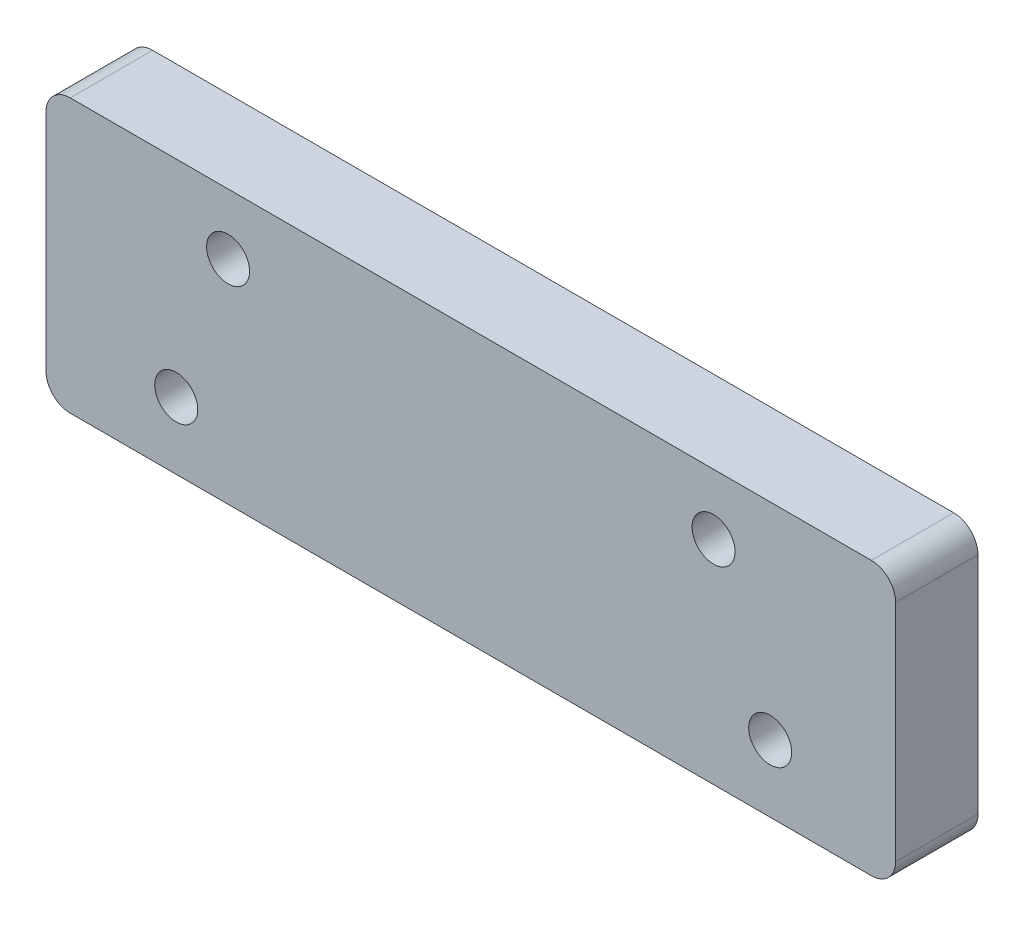
ISO-10303-21;
HEADER;
FILE_DESCRIPTION(('STEP AP214'),'2;1');
FILE_NAME('part.step','',(''),(''),'','','');
FILE_SCHEMA(('AUTOMOTIVE_DESIGN { 1 0 10303 214 1 1 1 1 }'));
ENDSEC;
DATA;
#1=APPLICATION_CONTEXT('core data for automotive mechanical design processes');
#2=APPLICATION_PROTOCOL_DEFINITION('international standard','automotive_design',2000,#1);
#3=PRODUCT_CONTEXT('',#1,'mechanical');
#4=PRODUCT('Part','Part','',(#3));
#5=PRODUCT_RELATED_PRODUCT_CATEGORY('part','',(#4));
#6=PRODUCT_DEFINITION_FORMATION('','',#4);
#7=PRODUCT_DEFINITION_CONTEXT('part definition',#1,'design');
#8=PRODUCT_DEFINITION('design','',#6,#7);
#9=PRODUCT_DEFINITION_SHAPE('','',#8);
#10=(LENGTH_UNIT() NAMED_UNIT(*) SI_UNIT(.MILLI.,.METRE.));
#11=(NAMED_UNIT(*) PLANE_ANGLE_UNIT() SI_UNIT($,.RADIAN.));
#12=(NAMED_UNIT(*) SI_UNIT($,.STERADIAN.) SOLID_ANGLE_UNIT());
#13=UNCERTAINTY_MEASURE_WITH_UNIT(LENGTH_MEASURE(1.E-05),#10,'distance_accuracy_value','');
#14=(GEOMETRIC_REPRESENTATION_CONTEXT(3) GLOBAL_UNCERTAINTY_ASSIGNED_CONTEXT((#13)) GLOBAL_UNIT_ASSIGNED_CONTEXT((#10,
#11,#12)) REPRESENTATION_CONTEXT('',''));
#15=CARTESIAN_POINT('',(0.,0.,0.));
#16=DIRECTION('',(0.,0.,1.));
#17=DIRECTION('',(1.,0.,0.));
#18=AXIS2_PLACEMENT_3D('',#15,#16,#17);
#19=CARTESIAN_POINT('',(0.,0.,-8.62));
#20=DIRECTION('',(0.,0.,-1.));
#21=DIRECTION('',(-1.,0.,0.));
#22=AXIS2_PLACEMENT_3D('',#19,#20,#21);
#23=PLANE('',#22);
#24=CARTESIAN_POINT('',(93.225,6.99999999999999,-8.62));
#25=DIRECTION('',(0.,0.,-1.));
#26=DIRECTION('',(-1.,0.,0.));
#27=AXIS2_PLACEMENT_3D('',#24,#25,#26);
#28=CIRCLE('',#27,4.00000000000001);
#29=CARTESIAN_POINT('',(89.225,6.99999999999999,-8.62));
#30=VERTEX_POINT('',#29);
#31=EDGE_CURVE('E187',#30,#30,#28,.T.);
#32=ORIENTED_EDGE('',*,*,#31,.F.);
#33=EDGE_LOOP('',(#32));
#34=FACE_BOUND('',#33,.T.);
#35=DIRECTION('',(1.00000000000003,0.,0.));
#36=VECTOR('',#35,1.);
#37=CARTESIAN_POINT('',(0.,28.5749999999998,-8.62000000000039));
#38=LINE('',#37,#36);
#39=CARTESIAN_POINT('',(19.990000000001,28.5749999999997,-8.62000000000041));
#40=VERTEX_POINT('',#39);
#41=CARTESIAN_POINT('',(103.810000000005,28.5749999999994,-8.62000000000053));
#42=VERTEX_POINT('',#41);
#43=EDGE_CURVE('E230',#40,#42,#38,.T.);
#44=ORIENTED_EDGE('',*,*,#43,.T.);
#45=CARTESIAN_POINT('',(103.81,26.0349999999994,-8.62));
#46=DIRECTION('',(0.,0.,-1.));
#47=DIRECTION('',(-1.,0.,0.));
#48=AXIS2_PLACEMENT_3D('',#45,#46,#47);
#49=CIRCLE('',#48,2.54);
#50=CARTESIAN_POINT('',(106.35,26.0349999999994,-8.62));
#51=VERTEX_POINT('',#50);
#52=EDGE_CURVE('E164',#42,#51,#49,.T.);
#53=ORIENTED_EDGE('',*,*,#52,.T.);
#54=DIRECTION('',(0.,-1.,0.));
#55=VECTOR('',#54,1.);
#56=CARTESIAN_POINT('',(106.35,15.875,-8.62));
#57=LINE('',#56,#55);
#58=CARTESIAN_POINT('',(106.35,2.54,-8.62));
#59=VERTEX_POINT('',#58);
#60=EDGE_CURVE('E184',#51,#59,#57,.T.);
#61=ORIENTED_EDGE('',*,*,#60,.T.);
#62=CARTESIAN_POINT('',(103.81,2.54,-8.62));
#63=DIRECTION('',(0.,0.,-1.));
#64=DIRECTION('',(-1.,0.,0.));
#65=AXIS2_PLACEMENT_3D('',#62,#63,#64);
#66=CIRCLE('',#65,2.54);
#67=CARTESIAN_POINT('',(103.81,0.,-8.62));
#68=VERTEX_POINT('',#67);
#69=EDGE_CURVE('E136',#59,#68,#66,.T.);
#70=ORIENTED_EDGE('',*,*,#69,.T.);
#71=DIRECTION('',(-1.,0.,0.));
#72=VECTOR('',#71,1.);
#73=CARTESIAN_POINT('',(106.35,0.,-8.62));
#74=LINE('',#73,#72);
#75=CARTESIAN_POINT('',(19.99,0.,-8.62));
#76=VERTEX_POINT('',#75);
#77=EDGE_CURVE('E177',#68,#76,#74,.T.);
#78=ORIENTED_EDGE('',*,*,#77,.T.);
#79=CARTESIAN_POINT('',(19.99,2.53999999999999,-8.62));
#80=DIRECTION('',(0.,0.,-1.));
#81=DIRECTION('',(-1.,0.,0.));
#82=AXIS2_PLACEMENT_3D('',#79,#80,#81);
#83=CIRCLE('',#82,2.54);
#84=CARTESIAN_POINT('',(17.45,2.53999999999999,-8.62));
#85=VERTEX_POINT('',#84);
#86=EDGE_CURVE('E65',#76,#85,#83,.T.);
#87=ORIENTED_EDGE('',*,*,#86,.T.);
#88=DIRECTION('',(0.,1.,0.));
#89=VECTOR('',#88,1.);
#90=CARTESIAN_POINT('',(17.45,0.,-8.62));
#91=LINE('',#90,#89);
#92=CARTESIAN_POINT('',(17.45,26.0349999999997,-8.62));
#93=VERTEX_POINT('',#92);
#94=EDGE_CURVE('E179',#85,#93,#91,.T.);
#95=ORIENTED_EDGE('',*,*,#94,.T.);
#96=CARTESIAN_POINT('',(19.99,26.0349999999997,-8.62));
#97=DIRECTION('',(0.,0.,-1.));
#98=DIRECTION('',(-1.,0.,0.));
#99=AXIS2_PLACEMENT_3D('',#96,#97,#98);
#100=CIRCLE('',#99,2.54);
#101=EDGE_CURVE('E157',#93,#40,#100,.T.);
#102=ORIENTED_EDGE('',*,*,#101,.T.);
#103=EDGE_LOOP('',(#44,#53,#61,#70,#78,#87,#95,#102));
#104=FACE_BOUND('',#103,.T.);
#105=CARTESIAN_POINT('',(31.0749999999999,7.00000000000008,-8.62));
#106=DIRECTION('',(0.,0.,-1.));
#107=DIRECTION('',(-1.,0.,0.));
#108=AXIS2_PLACEMENT_3D('',#105,#106,#107);
#109=CIRCLE('',#108,4.);
#110=CARTESIAN_POINT('',(27.0749999999999,7.00000000000008,-8.62));
#111=VERTEX_POINT('',#110);
#112=EDGE_CURVE('E180',#111,#111,#109,.T.);
#113=ORIENTED_EDGE('',*,*,#112,.F.);
#114=EDGE_LOOP('',(#113));
#115=FACE_BOUND('',#114,.T.);
#116=CARTESIAN_POINT('',(87.3,22.225,-8.62));
#117=DIRECTION('',(0.,0.,1.));
#118=DIRECTION('',(1.,0.,0.));
#119=AXIS2_PLACEMENT_3D('',#116,#117,#118);
#120=CIRCLE('',#119,2.25);
#121=CARTESIAN_POINT('',(89.55,22.225,-8.62));
#122=VERTEX_POINT('',#121);
#123=EDGE_CURVE('E242',#122,#122,#120,.T.);
#124=ORIENTED_EDGE('',*,*,#123,.T.);
#125=EDGE_LOOP('',(#124));
#126=FACE_BOUND('',#125,.T.);
#127=CARTESIAN_POINT('',(36.5,22.225,-8.62));
#128=DIRECTION('',(0.,0.,1.));
#129=DIRECTION('',(1.,0.,0.));
#130=AXIS2_PLACEMENT_3D('',#127,#128,#129);
#131=CIRCLE('',#130,2.25);
#132=CARTESIAN_POINT('',(38.75,22.225,-8.62));
#133=VERTEX_POINT('',#132);
#134=EDGE_CURVE('E252',#133,#133,#131,.T.);
#135=ORIENTED_EDGE('',*,*,#134,.T.);
#136=EDGE_LOOP('',(#135));
#137=FACE_BOUND('',#136,.T.);
#138=ADVANCED_FACE('F43',(#34,#104,#115,#126,#137),#23,.T.);
#139=CARTESIAN_POINT('',(17.45,15.875,-7.62));
#140=DIRECTION('',(-1.,0.,0.));
#141=DIRECTION('',(0.,-1.,0.));
#142=AXIS2_PLACEMENT_3D('',#139,#140,#141);
#143=PLANE('',#142);
#144=ORIENTED_EDGE('',*,*,#94,.F.);
#145=DIRECTION('',(0.,0.,1.));
#146=VECTOR('',#145,1.);
#147=CARTESIAN_POINT('',(17.45,2.53999999999999,-7.62));
#148=LINE('',#147,#146);
#149=CARTESIAN_POINT('',(17.45,2.53999999999999,0.));
#150=VERTEX_POINT('',#149);
#151=EDGE_CURVE('E11',#85,#150,#148,.T.);
#152=ORIENTED_EDGE('',*,*,#151,.T.);
#153=DIRECTION('',(0.,-1.,0.));
#154=VECTOR('',#153,1.);
#155=CARTESIAN_POINT('',(17.45,15.875,0.));
#156=LINE('',#155,#154);
#157=CARTESIAN_POINT('',(17.45,26.0349999999997,0.));
#158=VERTEX_POINT('',#157);
#159=EDGE_CURVE('E217',#158,#150,#156,.T.);
#160=ORIENTED_EDGE('',*,*,#159,.F.);
#161=DIRECTION('',(0.,0.,1.));
#162=VECTOR('',#161,1.);
#163=CARTESIAN_POINT('',(17.45,26.0349999999997,-8.62));
#164=LINE('',#163,#162);
#165=EDGE_CURVE('E52',#158,#93,#164,.F.);
#166=ORIENTED_EDGE('',*,*,#165,.T.);
#167=EDGE_LOOP('',(#144,#152,#160,#166));
#168=FACE_BOUND('',#167,.T.);
#169=ADVANCED_FACE('F222',(#168),#143,.T.);
#170=CARTESIAN_POINT('',(106.35,15.875,-7.62));
#171=DIRECTION('',(1.,0.,0.));
#172=DIRECTION('',(0.,0.,-1.));
#173=AXIS2_PLACEMENT_3D('',#170,#171,#172);
#174=PLANE('',#173);
#175=ORIENTED_EDGE('',*,*,#60,.F.);
#176=DIRECTION('',(0.,0.,1.));
#177=VECTOR('',#176,1.);
#178=CARTESIAN_POINT('',(106.35,26.0349999999994,0.));
#179=LINE('',#178,#177);
#180=CARTESIAN_POINT('',(106.35,26.0349999999994,0.));
#181=VERTEX_POINT('',#180);
#182=EDGE_CURVE('E131',#51,#181,#179,.T.);
#183=ORIENTED_EDGE('',*,*,#182,.T.);
#184=DIRECTION('',(0.,1.,0.));
#185=VECTOR('',#184,1.);
#186=CARTESIAN_POINT('',(106.35,15.875,0.));
#187=LINE('',#186,#185);
#188=CARTESIAN_POINT('',(106.35,2.54,0.));
#189=VERTEX_POINT('',#188);
#190=EDGE_CURVE('E113',#189,#181,#187,.T.);
#191=ORIENTED_EDGE('',*,*,#190,.F.);
#192=DIRECTION('',(0.,0.,1.));
#193=VECTOR('',#192,1.);
#194=CARTESIAN_POINT('',(106.35,2.54,-7.62));
#195=LINE('',#194,#193);
#196=EDGE_CURVE('E128',#189,#59,#195,.F.);
#197=ORIENTED_EDGE('',*,*,#196,.T.);
#198=EDGE_LOOP('',(#175,#183,#191,#197));
#199=FACE_BOUND('',#198,.T.);
#200=ADVANCED_FACE('F127',(#199),#174,.T.);
#201=CARTESIAN_POINT('',(106.35,0.,-7.62));
#202=DIRECTION('',(0.,-1.,0.));
#203=DIRECTION('',(1.,0.,0.));
#204=AXIS2_PLACEMENT_3D('',#201,#202,#203);
#205=PLANE('',#204);
#206=ORIENTED_EDGE('',*,*,#77,.F.);
#207=DIRECTION('',(0.,0.,1.));
#208=VECTOR('',#207,1.);
#209=CARTESIAN_POINT('',(103.81,0.,-7.62));
#210=LINE('',#209,#208);
#211=CARTESIAN_POINT('',(103.81,0.,0.));
#212=VERTEX_POINT('',#211);
#213=EDGE_CURVE('E170',#68,#212,#210,.T.);
#214=ORIENTED_EDGE('',*,*,#213,.T.);
#215=DIRECTION('',(1.,0.,0.));
#216=VECTOR('',#215,1.);
#217=CARTESIAN_POINT('',(106.35,0.,0.));
#218=LINE('',#217,#216);
#219=CARTESIAN_POINT('',(19.99,0.,0.));
#220=VERTEX_POINT('',#219);
#221=EDGE_CURVE('E115',#220,#212,#218,.T.);
#222=ORIENTED_EDGE('',*,*,#221,.F.);
#223=DIRECTION('',(0.,0.,1.));
#224=VECTOR('',#223,1.);
#225=CARTESIAN_POINT('',(19.99,0.,-7.62));
#226=LINE('',#225,#224);
#227=EDGE_CURVE('E167',#220,#76,#226,.F.);
#228=ORIENTED_EDGE('',*,*,#227,.T.);
#229=EDGE_LOOP('',(#206,#214,#222,#228));
#230=FACE_BOUND('',#229,.T.);
#231=ADVANCED_FACE('F175',(#230),#205,.T.);
#232=CARTESIAN_POINT('',(0.,0.,0.));
#233=DIRECTION('',(0.,0.,-1.));
#234=DIRECTION('',(-1.,0.,0.));
#235=AXIS2_PLACEMENT_3D('',#232,#233,#234);
#236=PLANE('',#235);
#237=CARTESIAN_POINT('',(36.5,22.225,0.));
#238=DIRECTION('',(0.,0.,1.));
#239=DIRECTION('',(1.,0.,0.));
#240=AXIS2_PLACEMENT_3D('',#237,#238,#239);
#241=CIRCLE('',#240,2.24999999999999);
#242=CARTESIAN_POINT('',(38.75,22.225,0.));
#243=VERTEX_POINT('',#242);
#244=EDGE_CURVE('E256',#243,#243,#241,.T.);
#245=ORIENTED_EDGE('',*,*,#244,.F.);
#246=EDGE_LOOP('',(#245));
#247=FACE_BOUND('',#246,.T.);
#248=CARTESIAN_POINT('',(87.3,22.225,0.));
#249=DIRECTION('',(0.,0.,1.));
#250=DIRECTION('',(1.,0.,0.));
#251=AXIS2_PLACEMENT_3D('',#248,#249,#250);
#252=CIRCLE('',#251,2.24999999999999);
#253=CARTESIAN_POINT('',(89.55,22.225,0.));
#254=VERTEX_POINT('',#253);
#255=EDGE_CURVE('E248',#254,#254,#252,.T.);
#256=ORIENTED_EDGE('',*,*,#255,.F.);
#257=EDGE_LOOP('',(#256));
#258=FACE_BOUND('',#257,.T.);
#259=CARTESIAN_POINT('',(93.225,6.99999999999999,0.));
#260=DIRECTION('',(0.,0.,-1.));
#261=DIRECTION('',(-1.,0.,0.));
#262=AXIS2_PLACEMENT_3D('',#259,#260,#261);
#263=CIRCLE('',#262,2.25);
#264=CARTESIAN_POINT('',(90.975,6.99999999999999,0.));
#265=VERTEX_POINT('',#264);
#266=EDGE_CURVE('E201',#265,#265,#263,.T.);
#267=ORIENTED_EDGE('',*,*,#266,.T.);
#268=EDGE_LOOP('',(#267));
#269=FACE_BOUND('',#268,.T.);
#270=CARTESIAN_POINT('',(31.0749999999999,7.00000000000008,0.));
#271=DIRECTION('',(0.,0.,-1.));
#272=DIRECTION('',(-1.,0.,0.));
#273=AXIS2_PLACEMENT_3D('',#270,#271,#272);
#274=CIRCLE('',#273,2.25);
#275=CARTESIAN_POINT('',(28.8249999999999,7.00000000000008,0.));
#276=VERTEX_POINT('',#275);
#277=EDGE_CURVE('E213',#276,#276,#274,.T.);
#278=ORIENTED_EDGE('',*,*,#277,.T.);
#279=EDGE_LOOP('',(#278));
#280=FACE_BOUND('',#279,.T.);
#281=ORIENTED_EDGE('',*,*,#190,.T.);
#282=CARTESIAN_POINT('',(103.81,26.0349999999994,0.));
#283=DIRECTION('',(0.,0.,-1.));
#284=DIRECTION('',(-1.,0.,0.));
#285=AXIS2_PLACEMENT_3D('',#282,#283,#284);
#286=CIRCLE('',#285,2.54);
#287=CARTESIAN_POINT('',(103.810000000005,28.5749999999994,-5.32283210563648E-13));
#288=VERTEX_POINT('',#287);
#289=EDGE_CURVE('E121',#181,#288,#286,.F.);
#290=ORIENTED_EDGE('',*,*,#289,.T.);
#291=DIRECTION('',(1.00000000000003,0.,0.));
#292=VECTOR('',#291,1.);
#293=CARTESIAN_POINT('',(0.,28.5749999999998,-3.88578058618805E-13));
#294=LINE('',#293,#292);
#295=CARTESIAN_POINT('',(19.990000000001,28.5749999999997,-4.16250402202057E-13));
#296=VERTEX_POINT('',#295);
#297=EDGE_CURVE('E237',#296,#288,#294,.T.);
#298=ORIENTED_EDGE('',*,*,#297,.F.);
#299=CARTESIAN_POINT('',(19.99,26.0349999999997,0.));
#300=DIRECTION('',(0.,0.,-1.));
#301=DIRECTION('',(-1.,0.,0.));
#302=AXIS2_PLACEMENT_3D('',#299,#300,#301);
#303=CIRCLE('',#302,2.54);
#304=EDGE_CURVE('E140',#296,#158,#303,.F.);
#305=ORIENTED_EDGE('',*,*,#304,.T.);
#306=ORIENTED_EDGE('',*,*,#159,.T.);
#307=CARTESIAN_POINT('',(19.99,2.53999999999999,0.));
#308=DIRECTION('',(0.,0.,-1.));
#309=DIRECTION('',(-1.,0.,0.));
#310=AXIS2_PLACEMENT_3D('',#307,#308,#309);
#311=CIRCLE('',#310,2.54);
#312=EDGE_CURVE('E122',#150,#220,#311,.F.);
#313=ORIENTED_EDGE('',*,*,#312,.T.);
#314=ORIENTED_EDGE('',*,*,#221,.T.);
#315=CARTESIAN_POINT('',(103.81,2.54,0.));
#316=DIRECTION('',(0.,0.,-1.));
#317=DIRECTION('',(-1.,0.,0.));
#318=AXIS2_PLACEMENT_3D('',#315,#316,#317);
#319=CIRCLE('',#318,2.54);
#320=EDGE_CURVE('E110',#212,#189,#319,.F.);
#321=ORIENTED_EDGE('',*,*,#320,.T.);
#322=EDGE_LOOP('',(#281,#290,#298,#305,#306,#313,#314,#321));
#323=FACE_BOUND('',#322,.T.);
#324=ADVANCED_FACE('F112',(#247,#258,#269,#280,#323),#236,.F.);
#325=CARTESIAN_POINT('',(31.0749999999999,7.00000000000008,-7.62));
#326=DIRECTION('',(0.,0.,-1.));
#327=DIRECTION('',(-1.,0.,0.));
#328=AXIS2_PLACEMENT_3D('',#325,#326,#327);
#329=CYLINDRICAL_SURFACE('',#328,2.25);
#330=ORIENTED_EDGE('',*,*,#277,.F.);
#331=EDGE_LOOP('',(#330));
#332=FACE_BOUND('',#331,.T.);
#333=CARTESIAN_POINT('',(31.0749999999999,7.00000000000008,-3.62));
#334=DIRECTION('',(0.,0.,-1.));
#335=DIRECTION('',(-1.,0.,0.));
#336=AXIS2_PLACEMENT_3D('',#333,#334,#335);
#337=CIRCLE('',#336,2.25);
#338=CARTESIAN_POINT('',(28.8249999999999,7.00000000000008,-3.62));
#339=VERTEX_POINT('',#338);
#340=EDGE_CURVE('E209',#339,#339,#337,.T.);
#341=ORIENTED_EDGE('',*,*,#340,.T.);
#342=EDGE_LOOP('',(#341));
#343=FACE_BOUND('',#342,.T.);
#344=ADVANCED_FACE('F265',(#332,#343),#329,.F.);
#345=CARTESIAN_POINT('',(33.3249999999999,7.00000000000008,-3.62));
#346=DIRECTION('',(0.,0.,1.));
#347=DIRECTION('',(1.,0.,0.));
#348=AXIS2_PLACEMENT_3D('',#345,#346,#347);
#349=PLANE('',#348);
#350=ORIENTED_EDGE('',*,*,#340,.F.);
#351=EDGE_LOOP('',(#350));
#352=FACE_BOUND('',#351,.T.);
#353=CARTESIAN_POINT('',(31.0749999999999,7.00000000000008,-3.62));
#354=DIRECTION('',(0.,0.,-1.));
#355=DIRECTION('',(-1.,0.,0.));
#356=AXIS2_PLACEMENT_3D('',#353,#354,#355);
#357=CIRCLE('',#356,4.);
#358=CARTESIAN_POINT('',(27.0749999999999,7.00000000000008,-3.62));
#359=VERTEX_POINT('',#358);
#360=EDGE_CURVE('E205',#359,#359,#357,.T.);
#361=ORIENTED_EDGE('',*,*,#360,.T.);
#362=EDGE_LOOP('',(#361));
#363=FACE_BOUND('',#362,.T.);
#364=ADVANCED_FACE('F275',(#352,#363),#349,.F.);
#365=CARTESIAN_POINT('',(31.0749999999999,7.00000000000008,-7.62));
#366=DIRECTION('',(0.,0.,-1.));
#367=DIRECTION('',(-1.,0.,0.));
#368=AXIS2_PLACEMENT_3D('',#365,#366,#367);
#369=CYLINDRICAL_SURFACE('',#368,4.);
#370=ORIENTED_EDGE('',*,*,#360,.F.);
#371=EDGE_LOOP('',(#370));
#372=FACE_BOUND('',#371,.T.);
#373=ORIENTED_EDGE('',*,*,#112,.T.);
#374=EDGE_LOOP('',(#373));
#375=FACE_BOUND('',#374,.T.);
#376=ADVANCED_FACE('F281',(#372,#375),#369,.F.);
#377=CARTESIAN_POINT('',(93.225,6.99999999999999,-7.62));
#378=DIRECTION('',(0.,0.,-1.));
#379=DIRECTION('',(-1.,0.,0.));
#380=AXIS2_PLACEMENT_3D('',#377,#378,#379);
#381=CYLINDRICAL_SURFACE('',#380,2.25);
#382=ORIENTED_EDGE('',*,*,#266,.F.);
#383=EDGE_LOOP('',(#382));
#384=FACE_BOUND('',#383,.T.);
#385=CARTESIAN_POINT('',(93.225,6.99999999999999,-3.62));
#386=DIRECTION('',(0.,0.,-1.));
#387=DIRECTION('',(-1.,0.,0.));
#388=AXIS2_PLACEMENT_3D('',#385,#386,#387);
#389=CIRCLE('',#388,2.25);
#390=CARTESIAN_POINT('',(90.975,6.99999999999999,-3.62));
#391=VERTEX_POINT('',#390);
#392=EDGE_CURVE('E197',#391,#391,#389,.T.);
#393=ORIENTED_EDGE('',*,*,#392,.T.);
#394=EDGE_LOOP('',(#393));
#395=FACE_BOUND('',#394,.T.);
#396=ADVANCED_FACE('F287',(#384,#395),#381,.F.);
#397=CARTESIAN_POINT('',(95.475,6.99999999999999,-3.62));
#398=DIRECTION('',(0.,0.,1.));
#399=DIRECTION('',(1.,0.,0.));
#400=AXIS2_PLACEMENT_3D('',#397,#398,#399);
#401=PLANE('',#400);
#402=ORIENTED_EDGE('',*,*,#392,.F.);
#403=EDGE_LOOP('',(#402));
#404=FACE_BOUND('',#403,.T.);
#405=CARTESIAN_POINT('',(93.225,6.99999999999999,-3.62));
#406=DIRECTION('',(0.,0.,-1.));
#407=DIRECTION('',(-1.,0.,0.));
#408=AXIS2_PLACEMENT_3D('',#405,#406,#407);
#409=CIRCLE('',#408,4.);
#410=CARTESIAN_POINT('',(89.225,6.99999999999999,-3.62));
#411=VERTEX_POINT('',#410);
#412=EDGE_CURVE('E193',#411,#411,#409,.T.);
#413=ORIENTED_EDGE('',*,*,#412,.T.);
#414=EDGE_LOOP('',(#413));
#415=FACE_BOUND('',#414,.T.);
#416=ADVANCED_FACE('F316',(#404,#415),#401,.F.);
#417=CARTESIAN_POINT('',(93.225,6.99999999999999,-7.62));
#418=DIRECTION('',(0.,0.,-1.));
#419=DIRECTION('',(-1.,0.,0.));
#420=AXIS2_PLACEMENT_3D('',#417,#418,#419);
#421=CYLINDRICAL_SURFACE('',#420,4.);
#422=ORIENTED_EDGE('',*,*,#412,.F.);
#423=EDGE_LOOP('',(#422));
#424=FACE_BOUND('',#423,.T.);
#425=ORIENTED_EDGE('',*,*,#31,.T.);
#426=EDGE_LOOP('',(#425));
#427=FACE_BOUND('',#426,.T.);
#428=ADVANCED_FACE('F312',(#424,#427),#421,.F.);
#429=CARTESIAN_POINT('',(0.,28.5749999999998,-8.62000000000039));
#430=DIRECTION('',(0.,-1.,0.));
#431=DIRECTION('',(1.,0.,0.));
#432=AXIS2_PLACEMENT_3D('',#429,#430,#431);
#433=PLANE('',#432);
#434=ORIENTED_EDGE('',*,*,#297,.T.);
#435=DIRECTION('',(0.,0.,1.));
#436=VECTOR('',#435,1.);
#437=CARTESIAN_POINT('',(103.81,28.5749999999994,-8.62));
#438=LINE('',#437,#436);
#439=EDGE_CURVE('E154',#288,#42,#438,.F.);
#440=ORIENTED_EDGE('',*,*,#439,.T.);
#441=ORIENTED_EDGE('',*,*,#43,.F.);
#442=DIRECTION('',(0.,0.,1.));
#443=VECTOR('',#442,1.);
#444=CARTESIAN_POINT('',(19.99,28.5749999999997,0.));
#445=LINE('',#444,#443);
#446=EDGE_CURVE('E150',#40,#296,#445,.T.);
#447=ORIENTED_EDGE('',*,*,#446,.T.);
#448=EDGE_LOOP('',(#434,#440,#441,#447));
#449=FACE_BOUND('',#448,.T.);
#450=ADVANCED_FACE('F234',(#449),#433,.F.);
#451=CARTESIAN_POINT('',(87.3,22.225,0.));
#452=DIRECTION('',(0.,0.,1.));
#453=DIRECTION('',(1.,0.,0.));
#454=AXIS2_PLACEMENT_3D('',#451,#452,#453);
#455=CYLINDRICAL_SURFACE('',#454,2.25);
#456=ORIENTED_EDGE('',*,*,#123,.F.);
#457=EDGE_LOOP('',(#456));
#458=FACE_BOUND('',#457,.T.);
#459=ORIENTED_EDGE('',*,*,#255,.T.);
#460=EDGE_LOOP('',(#459));
#461=FACE_BOUND('',#460,.T.);
#462=ADVANCED_FACE('F300',(#458,#461),#455,.F.);
#463=CARTESIAN_POINT('',(36.5,22.225,0.));
#464=DIRECTION('',(0.,0.,1.));
#465=DIRECTION('',(1.,0.,0.));
#466=AXIS2_PLACEMENT_3D('',#463,#464,#465);
#467=CYLINDRICAL_SURFACE('',#466,2.24999999999999);
#468=ORIENTED_EDGE('',*,*,#134,.F.);
#469=EDGE_LOOP('',(#468));
#470=FACE_BOUND('',#469,.T.);
#471=ORIENTED_EDGE('',*,*,#244,.T.);
#472=EDGE_LOOP('',(#471));
#473=FACE_BOUND('',#472,.T.);
#474=ADVANCED_FACE('F261',(#470,#473),#467,.F.);
#475=CARTESIAN_POINT('',(103.81,26.0349999999994,-7.62));
#476=DIRECTION('',(0.,0.,-1.));
#477=DIRECTION('',(-1.,0.,0.));
#478=AXIS2_PLACEMENT_3D('',#475,#476,#477);
#479=CYLINDRICAL_SURFACE('',#478,2.54);
#480=ORIENTED_EDGE('',*,*,#52,.F.);
#481=ORIENTED_EDGE('',*,*,#439,.F.);
#482=ORIENTED_EDGE('',*,*,#289,.F.);
#483=ORIENTED_EDGE('',*,*,#182,.F.);
#484=EDGE_LOOP('',(#480,#481,#482,#483));
#485=FACE_BOUND('',#484,.T.);
#486=ADVANCED_FACE('F299',(#485),#479,.T.);
#487=CARTESIAN_POINT('',(103.81,2.54,-7.62));
#488=DIRECTION('',(0.,0.,1.));
#489=DIRECTION('',(1.,0.,0.));
#490=AXIS2_PLACEMENT_3D('',#487,#488,#489);
#491=CYLINDRICAL_SURFACE('',#490,2.54);
#492=ORIENTED_EDGE('',*,*,#69,.F.);
#493=ORIENTED_EDGE('',*,*,#196,.F.);
#494=ORIENTED_EDGE('',*,*,#320,.F.);
#495=ORIENTED_EDGE('',*,*,#213,.F.);
#496=EDGE_LOOP('',(#492,#493,#494,#495));
#497=FACE_BOUND('',#496,.T.);
#498=ADVANCED_FACE('F135',(#497),#491,.T.);
#499=CARTESIAN_POINT('',(19.99,2.53999999999999,-7.62));
#500=DIRECTION('',(0.,0.,1.));
#501=DIRECTION('',(1.,0.,0.));
#502=AXIS2_PLACEMENT_3D('',#499,#500,#501);
#503=CYLINDRICAL_SURFACE('',#502,2.54);
#504=ORIENTED_EDGE('',*,*,#86,.F.);
#505=ORIENTED_EDGE('',*,*,#227,.F.);
#506=ORIENTED_EDGE('',*,*,#312,.F.);
#507=ORIENTED_EDGE('',*,*,#151,.F.);
#508=EDGE_LOOP('',(#504,#505,#506,#507));
#509=FACE_BOUND('',#508,.T.);
#510=ADVANCED_FACE('F331',(#509),#503,.T.);
#511=CARTESIAN_POINT('',(19.99,26.0349999999997,-8.62000000000039));
#512=DIRECTION('',(0.,0.,-1.));
#513=DIRECTION('',(-1.,0.,0.));
#514=AXIS2_PLACEMENT_3D('',#511,#512,#513);
#515=CYLINDRICAL_SURFACE('',#514,2.54);
#516=ORIENTED_EDGE('',*,*,#101,.F.);
#517=ORIENTED_EDGE('',*,*,#165,.F.);
#518=ORIENTED_EDGE('',*,*,#304,.F.);
#519=ORIENTED_EDGE('',*,*,#446,.F.);
#520=EDGE_LOOP('',(#516,#517,#518,#519));
#521=FACE_BOUND('',#520,.T.);
#522=ADVANCED_FACE('F45',(#521),#515,.T.);
#523=CLOSED_SHELL('',(#138,#169,#200,#231,#324,#344,#364,#376,#396,#416,#428,#450,#462,#474,
#486,#498,#510,#522));
#524=MANIFOLD_SOLID_BREP('B2',#523);
#525=ADVANCED_BREP_SHAPE_REPRESENTATION('',(#18,#524),#14);
#526=SHAPE_DEFINITION_REPRESENTATION(#9,#525);
ENDSEC;
END-ISO-10303-21;
